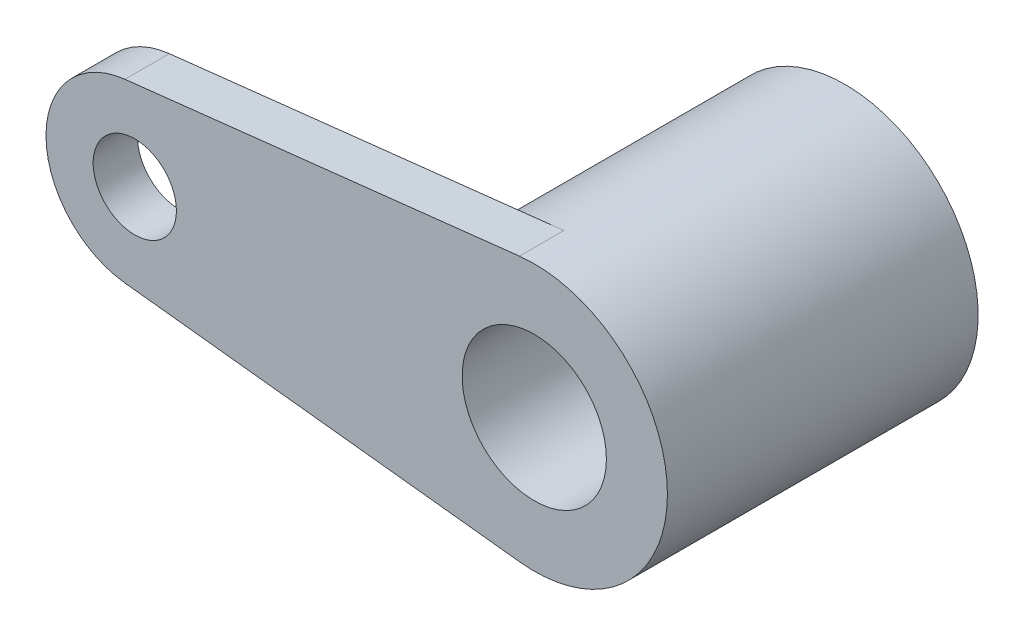
ISO-10303-21;
HEADER;
FILE_DESCRIPTION(('STEP AP214'),'2;1');
FILE_NAME('part.step','',(''),(''),'','','');
FILE_SCHEMA(('AUTOMOTIVE_DESIGN { 1 0 10303 214 1 1 1 1 }'));
ENDSEC;
DATA;
#1=APPLICATION_CONTEXT('core data for automotive mechanical design processes');
#2=APPLICATION_PROTOCOL_DEFINITION('international standard','automotive_design',2000,#1);
#3=PRODUCT_CONTEXT('',#1,'mechanical');
#4=PRODUCT('Part','Part','',(#3));
#5=PRODUCT_RELATED_PRODUCT_CATEGORY('part','',(#4));
#6=PRODUCT_DEFINITION_FORMATION('','',#4);
#7=PRODUCT_DEFINITION_CONTEXT('part definition',#1,'design');
#8=PRODUCT_DEFINITION('design','',#6,#7);
#9=PRODUCT_DEFINITION_SHAPE('','',#8);
#10=(LENGTH_UNIT() NAMED_UNIT(*) SI_UNIT(.MILLI.,.METRE.));
#11=(NAMED_UNIT(*) PLANE_ANGLE_UNIT() SI_UNIT($,.RADIAN.));
#12=(NAMED_UNIT(*) SI_UNIT($,.STERADIAN.) SOLID_ANGLE_UNIT());
#13=UNCERTAINTY_MEASURE_WITH_UNIT(LENGTH_MEASURE(1.E-05),#10,'distance_accuracy_value','');
#14=(GEOMETRIC_REPRESENTATION_CONTEXT(3) GLOBAL_UNCERTAINTY_ASSIGNED_CONTEXT((#13)) GLOBAL_UNIT_ASSIGNED_CONTEXT((#10,
#11,#12)) REPRESENTATION_CONTEXT('',''));
#15=CARTESIAN_POINT('',(0.,0.,0.));
#16=DIRECTION('',(0.,0.,1.));
#17=DIRECTION('',(1.,0.,0.));
#18=AXIS2_PLACEMENT_3D('',#15,#16,#17);
#19=CARTESIAN_POINT('',(-4.23333333333333,-37.8640844189964,12.7));
#20=DIRECTION('',(0.111111111111111,0.993807989999907,0.));
#21=DIRECTION('',(-0.993807989999907,0.111111111111111,0.));
#22=AXIS2_PLACEMENT_3D('',#19,#20,#21);
#23=PLANE('',#22);
#24=DIRECTION('',(0.993807989999907,-0.111111111111111,0.));
#25=VECTOR('',#24,1.);
#26=CARTESIAN_POINT('',(-4.23333333333333,-37.8640844189964,0.));
#27=LINE('',#26,#25);
#28=CARTESIAN_POINT('',(-117.122222222222,-25.2427229459976,0.));
#29=VERTEX_POINT('',#28);
#30=CARTESIAN_POINT('',(-4.23333333333333,-37.8640844189964,0.));
#31=VERTEX_POINT('',#30);
#32=EDGE_CURVE('E91',#29,#31,#27,.T.);
#33=ORIENTED_EDGE('',*,*,#32,.T.);
#34=DIRECTION('',(0.,0.,-1.));
#35=VECTOR('',#34,1.);
#36=CARTESIAN_POINT('',(-4.23333333333333,-37.8640844189964,12.7));
#37=LINE('',#36,#35);
#38=CARTESIAN_POINT('',(-4.23333333333333,-37.8640844189964,12.7));
#39=VERTEX_POINT('',#38);
#40=EDGE_CURVE('E41',#39,#31,#37,.T.);
#41=ORIENTED_EDGE('',*,*,#40,.F.);
#42=DIRECTION('',(0.993807989999907,-0.111111111111111,0.));
#43=VECTOR('',#42,1.);
#44=CARTESIAN_POINT('',(-4.23333333333333,-37.8640844189964,12.7));
#45=LINE('',#44,#43);
#46=CARTESIAN_POINT('',(-117.122222222222,-25.2427229459976,12.7));
#47=VERTEX_POINT('',#46);
#48=EDGE_CURVE('E113',#47,#39,#45,.T.);
#49=ORIENTED_EDGE('',*,*,#48,.F.);
#50=DIRECTION('',(0.,0.,-1.));
#51=VECTOR('',#50,1.);
#52=CARTESIAN_POINT('',(-117.122222222222,-25.2427229459976,12.7));
#53=LINE('',#52,#51);
#54=EDGE_CURVE('E103',#47,#29,#53,.T.);
#55=ORIENTED_EDGE('',*,*,#54,.T.);
#56=EDGE_LOOP('',(#33,#41,#49,#55));
#57=FACE_BOUND('',#56,.T.);
#58=ADVANCED_FACE('F38',(#57),#23,.F.);
#59=CARTESIAN_POINT('',(0.,0.,12.7));
#60=DIRECTION('',(0.,0.,-1.));
#61=DIRECTION('',(-1.,0.,0.));
#62=AXIS2_PLACEMENT_3D('',#59,#60,#61);
#63=CYLINDRICAL_SURFACE('',#62,38.1);
#64=ORIENTED_EDGE('',*,*,#40,.T.);
#65=CARTESIAN_POINT('',(0.,0.,0.));
#66=DIRECTION('',(0.,0.,-1.));
#67=DIRECTION('',(-1.,0.,0.));
#68=AXIS2_PLACEMENT_3D('',#65,#66,#67);
#69=CIRCLE('',#68,38.1);
#70=CARTESIAN_POINT('',(-4.23333333333334,37.8640844189964,0.));
#71=VERTEX_POINT('',#70);
#72=EDGE_CURVE('E11',#31,#71,#69,.T.);
#73=ORIENTED_EDGE('',*,*,#72,.T.);
#74=DIRECTION('',(0.,0.,-1.));
#75=VECTOR('',#74,1.);
#76=CARTESIAN_POINT('',(-4.23333333333335,37.8640844189964,12.7));
#77=LINE('',#76,#75);
#78=CARTESIAN_POINT('',(-4.23333333333335,37.8640844189964,12.7));
#79=VERTEX_POINT('',#78);
#80=EDGE_CURVE('E94',#79,#71,#77,.T.);
#81=ORIENTED_EDGE('',*,*,#80,.F.);
#82=CARTESIAN_POINT('',(0.,0.,12.7));
#83=DIRECTION('',(0.,0.,1.));
#84=DIRECTION('',(1.,0.,0.));
#85=AXIS2_PLACEMENT_3D('',#82,#83,#84);
#86=CIRCLE('',#85,38.1);
#87=EDGE_CURVE('E80',#39,#79,#86,.T.);
#88=ORIENTED_EDGE('',*,*,#87,.F.);
#89=EDGE_LOOP('',(#64,#73,#81,#88));
#90=FACE_BOUND('',#89,.T.);
#91=CARTESIAN_POINT('',(0.,0.,-76.2));
#92=DIRECTION('',(0.,0.,-1.));
#93=DIRECTION('',(-1.,0.,0.));
#94=AXIS2_PLACEMENT_3D('',#91,#92,#93);
#95=CIRCLE('',#94,38.1);
#96=CARTESIAN_POINT('',(-38.1,0.,-76.2));
#97=VERTEX_POINT('',#96);
#98=EDGE_CURVE('E122',#97,#97,#95,.T.);
#99=ORIENTED_EDGE('',*,*,#98,.F.);
#100=EDGE_LOOP('',(#99));
#101=FACE_BOUND('',#100,.T.);
#102=ADVANCED_FACE('F97',(#90,#101),#63,.T.);
#103=CARTESIAN_POINT('',(-4.23333333333334,37.8640844189964,12.7));
#104=DIRECTION('',(-0.111111111111111,0.993807989999907,0.));
#105=DIRECTION('',(-0.993807989999907,-0.111111111111111,0.));
#106=AXIS2_PLACEMENT_3D('',#103,#104,#105);
#107=PLANE('',#106);
#108=DIRECTION('',(0.993807989999907,0.111111111111111,0.));
#109=VECTOR('',#108,1.);
#110=CARTESIAN_POINT('',(-4.23333333333334,37.8640844189964,0.));
#111=LINE('',#110,#109);
#112=CARTESIAN_POINT('',(-117.122222222222,25.2427229459976,0.));
#113=VERTEX_POINT('',#112);
#114=EDGE_CURVE('E85',#113,#71,#111,.T.);
#115=ORIENTED_EDGE('',*,*,#114,.F.);
#116=DIRECTION('',(0.,0.,-1.));
#117=VECTOR('',#116,1.);
#118=CARTESIAN_POINT('',(-117.122222222222,25.2427229459976,12.7));
#119=LINE('',#118,#117);
#120=CARTESIAN_POINT('',(-117.122222222222,25.2427229459976,12.7));
#121=VERTEX_POINT('',#120);
#122=EDGE_CURVE('E69',#121,#113,#119,.T.);
#123=ORIENTED_EDGE('',*,*,#122,.F.);
#124=DIRECTION('',(0.993807989999907,0.111111111111111,0.));
#125=VECTOR('',#124,1.);
#126=CARTESIAN_POINT('',(-4.23333333333334,37.8640844189964,12.7));
#127=LINE('',#126,#125);
#128=EDGE_CURVE('E96',#121,#79,#127,.T.);
#129=ORIENTED_EDGE('',*,*,#128,.T.);
#130=ORIENTED_EDGE('',*,*,#80,.T.);
#131=EDGE_LOOP('',(#115,#123,#129,#130));
#132=FACE_BOUND('',#131,.T.);
#133=ADVANCED_FACE('F95',(#132),#107,.T.);
#134=CARTESIAN_POINT('',(-114.3,0.,12.7));
#135=DIRECTION('',(0.,0.,-1.));
#136=DIRECTION('',(-1.,0.,0.));
#137=AXIS2_PLACEMENT_3D('',#134,#135,#136);
#138=CYLINDRICAL_SURFACE('',#137,25.4);
#139=CARTESIAN_POINT('',(-114.3,0.,0.));
#140=DIRECTION('',(0.,0.,1.));
#141=DIRECTION('',(1.,0.,0.));
#142=AXIS2_PLACEMENT_3D('',#139,#140,#141);
#143=CIRCLE('',#142,25.4);
#144=EDGE_CURVE('E72',#113,#29,#143,.T.);
#145=ORIENTED_EDGE('',*,*,#144,.T.);
#146=ORIENTED_EDGE('',*,*,#54,.F.);
#147=CARTESIAN_POINT('',(-114.3,0.,12.7));
#148=DIRECTION('',(0.,0.,1.));
#149=DIRECTION('',(1.,0.,0.));
#150=AXIS2_PLACEMENT_3D('',#147,#148,#149);
#151=CIRCLE('',#150,25.4);
#152=EDGE_CURVE('E55',#121,#47,#151,.T.);
#153=ORIENTED_EDGE('',*,*,#152,.F.);
#154=ORIENTED_EDGE('',*,*,#122,.T.);
#155=EDGE_LOOP('',(#145,#146,#153,#154));
#156=FACE_BOUND('',#155,.T.);
#157=ADVANCED_FACE('F149',(#156),#138,.T.);
#158=CARTESIAN_POINT('',(0.,0.,12.7));
#159=DIRECTION('',(0.,0.,1.));
#160=DIRECTION('',(1.,0.,0.));
#161=AXIS2_PLACEMENT_3D('',#158,#159,#160);
#162=PLANE('',#161);
#163=CARTESIAN_POINT('',(0.,0.,12.7));
#164=DIRECTION('',(0.,0.,1.));
#165=DIRECTION('',(1.,0.,0.));
#166=AXIS2_PLACEMENT_3D('',#163,#164,#165);
#167=CIRCLE('',#166,20.6375);
#168=CARTESIAN_POINT('',(20.6375,0.,12.7));
#169=VERTEX_POINT('',#168);
#170=EDGE_CURVE('E120',#169,#169,#167,.T.);
#171=ORIENTED_EDGE('',*,*,#170,.F.);
#172=EDGE_LOOP('',(#171));
#173=FACE_BOUND('',#172,.T.);
#174=CARTESIAN_POINT('',(-114.3,0.,12.7));
#175=DIRECTION('',(0.,0.,1.));
#176=DIRECTION('',(1.,0.,0.));
#177=AXIS2_PLACEMENT_3D('',#174,#175,#176);
#178=CIRCLE('',#177,11.9126);
#179=CARTESIAN_POINT('',(-102.3874,0.,12.7));
#180=VERTEX_POINT('',#179);
#181=EDGE_CURVE('E107',#180,#180,#178,.T.);
#182=ORIENTED_EDGE('',*,*,#181,.F.);
#183=EDGE_LOOP('',(#182));
#184=FACE_BOUND('',#183,.T.);
#185=ORIENTED_EDGE('',*,*,#48,.T.);
#186=ORIENTED_EDGE('',*,*,#87,.T.);
#187=ORIENTED_EDGE('',*,*,#128,.F.);
#188=ORIENTED_EDGE('',*,*,#152,.T.);
#189=EDGE_LOOP('',(#185,#186,#187,#188));
#190=FACE_BOUND('',#189,.T.);
#191=ADVANCED_FACE('F154',(#173,#184,#190),#162,.T.);
#192=CARTESIAN_POINT('',(0.,0.,0.));
#193=DIRECTION('',(0.,0.,1.));
#194=DIRECTION('',(1.,0.,0.));
#195=AXIS2_PLACEMENT_3D('',#192,#193,#194);
#196=PLANE('',#195);
#197=ORIENTED_EDGE('',*,*,#72,.F.);
#198=ORIENTED_EDGE('',*,*,#32,.F.);
#199=ORIENTED_EDGE('',*,*,#144,.F.);
#200=ORIENTED_EDGE('',*,*,#114,.T.);
#201=EDGE_LOOP('',(#197,#198,#199,#200));
#202=FACE_BOUND('',#201,.T.);
#203=CARTESIAN_POINT('',(-114.3,0.,0.));
#204=DIRECTION('',(0.,0.,1.));
#205=DIRECTION('',(1.,0.,0.));
#206=AXIS2_PLACEMENT_3D('',#203,#204,#205);
#207=CIRCLE('',#206,11.9126);
#208=CARTESIAN_POINT('',(-102.3874,0.,0.));
#209=VERTEX_POINT('',#208);
#210=EDGE_CURVE('E104',#209,#209,#207,.T.);
#211=ORIENTED_EDGE('',*,*,#210,.T.);
#212=EDGE_LOOP('',(#211));
#213=FACE_BOUND('',#212,.T.);
#214=ADVANCED_FACE('F87',(#202,#213),#196,.F.);
#215=CARTESIAN_POINT('',(-114.3,0.,12.7));
#216=DIRECTION('',(0.,0.,1.));
#217=DIRECTION('',(1.,0.,0.));
#218=AXIS2_PLACEMENT_3D('',#215,#216,#217);
#219=CYLINDRICAL_SURFACE('',#218,11.9126);
#220=ORIENTED_EDGE('',*,*,#181,.T.);
#221=EDGE_LOOP('',(#220));
#222=FACE_BOUND('',#221,.T.);
#223=ORIENTED_EDGE('',*,*,#210,.F.);
#224=EDGE_LOOP('',(#223));
#225=FACE_BOUND('',#224,.T.);
#226=ADVANCED_FACE('F139',(#222,#225),#219,.F.);
#227=CARTESIAN_POINT('',(0.,0.,0.));
#228=DIRECTION('',(0.,0.,1.));
#229=DIRECTION('',(1.,0.,0.));
#230=AXIS2_PLACEMENT_3D('',#227,#228,#229);
#231=CYLINDRICAL_SURFACE('',#230,20.6375);
#232=ORIENTED_EDGE('',*,*,#170,.T.);
#233=EDGE_LOOP('',(#232));
#234=FACE_BOUND('',#233,.T.);
#235=CARTESIAN_POINT('',(0.,0.,-76.2));
#236=DIRECTION('',(0.,0.,-1.));
#237=DIRECTION('',(-1.,0.,0.));
#238=AXIS2_PLACEMENT_3D('',#235,#236,#237);
#239=CIRCLE('',#238,20.6375);
#240=CARTESIAN_POINT('',(-20.6375,0.,-76.2));
#241=VERTEX_POINT('',#240);
#242=EDGE_CURVE('E126',#241,#241,#239,.T.);
#243=ORIENTED_EDGE('',*,*,#242,.T.);
#244=EDGE_LOOP('',(#243));
#245=FACE_BOUND('',#244,.T.);
#246=ADVANCED_FACE('F130',(#234,#245),#231,.F.);
#247=CARTESIAN_POINT('',(0.,0.,-76.2));
#248=DIRECTION('',(0.,0.,-1.));
#249=DIRECTION('',(-1.,0.,0.));
#250=AXIS2_PLACEMENT_3D('',#247,#248,#249);
#251=PLANE('',#250);
#252=ORIENTED_EDGE('',*,*,#98,.T.);
#253=EDGE_LOOP('',(#252));
#254=FACE_BOUND('',#253,.T.);
#255=ORIENTED_EDGE('',*,*,#242,.F.);
#256=EDGE_LOOP('',(#255));
#257=FACE_BOUND('',#256,.T.);
#258=ADVANCED_FACE('F132',(#254,#257),#251,.T.);
#259=CLOSED_SHELL('',(#58,#102,#133,#157,#191,#214,#226,#246,#258));
#260=MANIFOLD_SOLID_BREP('B2',#259);
#261=ADVANCED_BREP_SHAPE_REPRESENTATION('',(#18,#260),#14);
#262=SHAPE_DEFINITION_REPRESENTATION(#9,#261);
ENDSEC;
END-ISO-10303-21;
